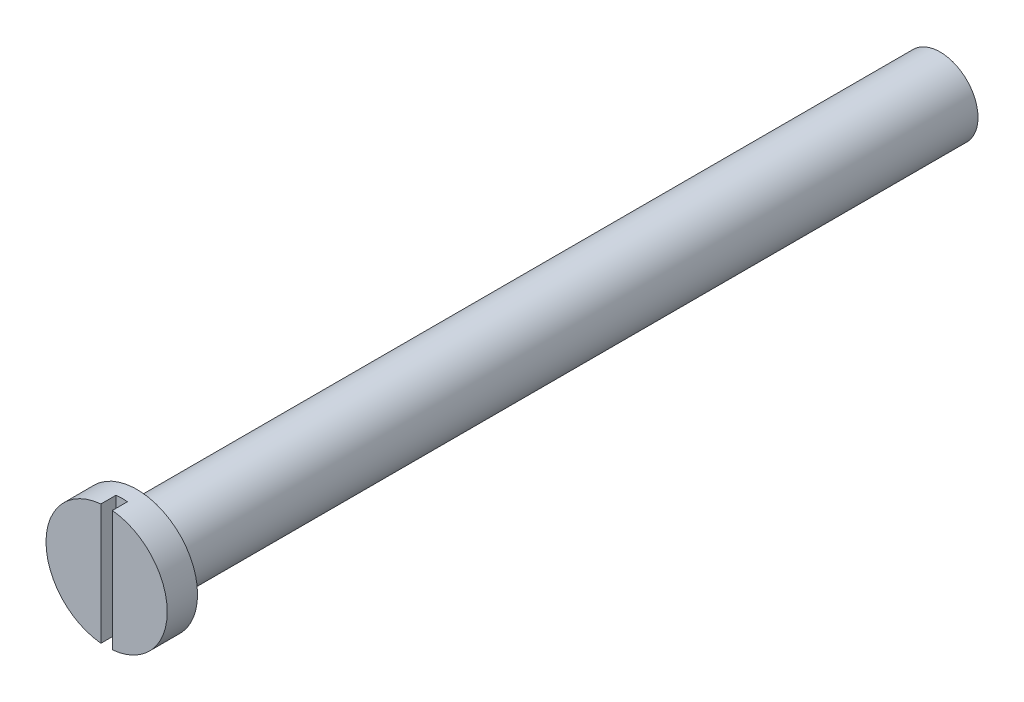
ISO-10303-21;
HEADER;
FILE_DESCRIPTION(('STEP AP214'),'2;1');
FILE_NAME('part.step','',(''),(''),'','','');
FILE_SCHEMA(('AUTOMOTIVE_DESIGN { 1 0 10303 214 1 1 1 1 }'));
ENDSEC;
DATA;
#1=APPLICATION_CONTEXT('core data for automotive mechanical design processes');
#2=APPLICATION_PROTOCOL_DEFINITION('international standard','automotive_design',2000,#1);
#3=PRODUCT_CONTEXT('',#1,'mechanical');
#4=PRODUCT('Part','Part','',(#3));
#5=PRODUCT_RELATED_PRODUCT_CATEGORY('part','',(#4));
#6=PRODUCT_DEFINITION_FORMATION('','',#4);
#7=PRODUCT_DEFINITION_CONTEXT('part definition',#1,'design');
#8=PRODUCT_DEFINITION('design','',#6,#7);
#9=PRODUCT_DEFINITION_SHAPE('','',#8);
#10=(LENGTH_UNIT() NAMED_UNIT(*) SI_UNIT(.MILLI.,.METRE.));
#11=(NAMED_UNIT(*) PLANE_ANGLE_UNIT() SI_UNIT($,.RADIAN.));
#12=(NAMED_UNIT(*) SI_UNIT($,.STERADIAN.) SOLID_ANGLE_UNIT());
#13=UNCERTAINTY_MEASURE_WITH_UNIT(LENGTH_MEASURE(1.E-05),#10,'distance_accuracy_value','');
#14=(GEOMETRIC_REPRESENTATION_CONTEXT(3) GLOBAL_UNCERTAINTY_ASSIGNED_CONTEXT((#13)) GLOBAL_UNIT_ASSIGNED_CONTEXT((#10,
#11,#12)) REPRESENTATION_CONTEXT('',''));
#15=CARTESIAN_POINT('',(0.,0.,0.));
#16=DIRECTION('',(0.,0.,1.));
#17=DIRECTION('',(1.,0.,0.));
#18=AXIS2_PLACEMENT_3D('',#15,#16,#17);
#19=CARTESIAN_POINT('',(0.,0.,110.));
#20=DIRECTION('',(0.,0.,1.));
#21=DIRECTION('',(1.,0.,0.));
#22=AXIS2_PLACEMENT_3D('',#19,#20,#21);
#23=PLANE('',#22);
#24=DIRECTION('',(0.,1.,0.));
#25=VECTOR('',#24,1.);
#26=CARTESIAN_POINT('',(0.75,0.,110.));
#27=LINE('',#26,#25);
#28=CARTESIAN_POINT('',(0.75,-7.96476616103699,110.));
#29=VERTEX_POINT('',#28);
#30=CARTESIAN_POINT('',(0.75,7.964766161037,110.));
#31=VERTEX_POINT('',#30);
#32=EDGE_CURVE('E122',#29,#31,#27,.T.);
#33=ORIENTED_EDGE('',*,*,#32,.F.);
#34=CARTESIAN_POINT('',(0.,0.,110.));
#35=DIRECTION('',(0.,0.,1.));
#36=DIRECTION('',(1.,0.,0.));
#37=AXIS2_PLACEMENT_3D('',#34,#35,#36);
#38=CIRCLE('',#37,8.);
#39=EDGE_CURVE('E109',#29,#31,#38,.T.);
#40=ORIENTED_EDGE('',*,*,#39,.T.);
#41=EDGE_LOOP('',(#33,#40));
#42=FACE_BOUND('',#41,.T.);
#43=ADVANCED_FACE('F37',(#42),#23,.T.);
#44=CARTESIAN_POINT('',(0.,0.,106.));
#45=DIRECTION('',(0.,0.,-1.));
#46=DIRECTION('',(-1.,0.,0.));
#47=AXIS2_PLACEMENT_3D('',#44,#45,#46);
#48=CYLINDRICAL_SURFACE('',#47,5.);
#49=CARTESIAN_POINT('',(0.,0.,106.));
#50=DIRECTION('',(0.,0.,1.));
#51=DIRECTION('',(1.,0.,0.));
#52=AXIS2_PLACEMENT_3D('',#49,#50,#51);
#53=CIRCLE('',#52,5.);
#54=CARTESIAN_POINT('',(5.,0.,106.));
#55=VERTEX_POINT('',#54);
#56=EDGE_CURVE('E115',#55,#55,#53,.T.);
#57=ORIENTED_EDGE('',*,*,#56,.F.);
#58=EDGE_LOOP('',(#57));
#59=FACE_BOUND('',#58,.T.);
#60=CARTESIAN_POINT('',(0.,0.,0.));
#61=DIRECTION('',(0.,0.,1.));
#62=DIRECTION('',(1.,0.,0.));
#63=AXIS2_PLACEMENT_3D('',#60,#61,#62);
#64=CIRCLE('',#63,5.);
#65=CARTESIAN_POINT('',(5.,0.,0.));
#66=VERTEX_POINT('',#65);
#67=EDGE_CURVE('E119',#66,#66,#64,.T.);
#68=ORIENTED_EDGE('',*,*,#67,.T.);
#69=EDGE_LOOP('',(#68));
#70=FACE_BOUND('',#69,.T.);
#71=ADVANCED_FACE('F39',(#59,#70),#48,.T.);
#72=CARTESIAN_POINT('',(0.,0.,0.));
#73=DIRECTION('',(0.,0.,1.));
#74=DIRECTION('',(1.,0.,0.));
#75=AXIS2_PLACEMENT_3D('',#72,#73,#74);
#76=PLANE('',#75);
#77=CARTESIAN_POINT('',(0.,0.,0.));
#78=DIRECTION('',(0.,0.,-1.));
#79=DIRECTION('',(-1.,0.,0.));
#80=AXIS2_PLACEMENT_3D('',#77,#78,#79);
#81=CIRCLE('',#80,3.4);
#82=CARTESIAN_POINT('',(-3.4,0.,0.));
#83=VERTEX_POINT('',#82);
#84=EDGE_CURVE('E91',#83,#83,#81,.T.);
#85=ORIENTED_EDGE('',*,*,#84,.F.);
#86=EDGE_LOOP('',(#85));
#87=FACE_BOUND('',#86,.T.);
#88=ORIENTED_EDGE('',*,*,#67,.F.);
#89=EDGE_LOOP('',(#88));
#90=FACE_BOUND('',#89,.T.);
#91=ADVANCED_FACE('F140',(#87,#90),#76,.F.);
#92=CARTESIAN_POINT('',(0.,0.,110.));
#93=DIRECTION('',(0.,0.,-1.));
#94=DIRECTION('',(-1.,0.,0.));
#95=AXIS2_PLACEMENT_3D('',#92,#93,#94);
#96=CYLINDRICAL_SURFACE('',#95,8.);
#97=CARTESIAN_POINT('',(0.,0.,108.));
#98=DIRECTION('',(0.,0.,1.));
#99=DIRECTION('',(1.,0.,0.));
#100=AXIS2_PLACEMENT_3D('',#97,#98,#99);
#101=CIRCLE('',#100,8.);
#102=CARTESIAN_POINT('',(0.75,7.964766161037,108.));
#103=VERTEX_POINT('',#102);
#104=CARTESIAN_POINT('',(-0.75,7.96476616103699,108.));
#105=VERTEX_POINT('',#104);
#106=EDGE_CURVE('E11',#103,#105,#101,.T.);
#107=ORIENTED_EDGE('',*,*,#106,.F.);
#108=DIRECTION('',(0.,0.,-1.));
#109=VECTOR('',#108,1.);
#110=CARTESIAN_POINT('',(0.75,7.964766161037,110.));
#111=LINE('',#110,#109);
#112=EDGE_CURVE('E60',#103,#31,#111,.F.);
#113=ORIENTED_EDGE('',*,*,#112,.T.);
#114=ORIENTED_EDGE('',*,*,#39,.F.);
#115=DIRECTION('',(0.,0.,-1.));
#116=VECTOR('',#115,1.);
#117=CARTESIAN_POINT('',(0.75,-7.964766161037,110.));
#118=LINE('',#117,#116);
#119=CARTESIAN_POINT('',(0.75,-7.964766161037,108.));
#120=VERTEX_POINT('',#119);
#121=EDGE_CURVE('E105',#29,#120,#118,.T.);
#122=ORIENTED_EDGE('',*,*,#121,.T.);
#123=CARTESIAN_POINT('',(-0.75,-7.96476616103699,108.));
#124=VERTEX_POINT('',#123);
#125=EDGE_CURVE('E41',#124,#120,#101,.T.);
#126=ORIENTED_EDGE('',*,*,#125,.F.);
#127=DIRECTION('',(0.,0.,-1.));
#128=VECTOR('',#127,1.);
#129=CARTESIAN_POINT('',(-0.75,-7.96476616103699,110.));
#130=LINE('',#129,#128);
#131=CARTESIAN_POINT('',(-0.75,-7.96476616103699,110.));
#132=VERTEX_POINT('',#131);
#133=EDGE_CURVE('E100',#124,#132,#130,.F.);
#134=ORIENTED_EDGE('',*,*,#133,.T.);
#135=CARTESIAN_POINT('',(-0.75,7.96476616103699,110.));
#136=VERTEX_POINT('',#135);
#137=EDGE_CURVE('E112',#136,#132,#38,.T.);
#138=ORIENTED_EDGE('',*,*,#137,.F.);
#139=DIRECTION('',(0.,0.,-1.));
#140=VECTOR('',#139,1.);
#141=CARTESIAN_POINT('',(-0.75,7.96476616103699,110.));
#142=LINE('',#141,#140);
#143=EDGE_CURVE('E52',#136,#105,#142,.T.);
#144=ORIENTED_EDGE('',*,*,#143,.T.);
#145=EDGE_LOOP('',(#107,#113,#114,#122,#126,#134,#138,#144));
#146=FACE_BOUND('',#145,.T.);
#147=CARTESIAN_POINT('',(0.,0.,106.));
#148=DIRECTION('',(0.,0.,1.));
#149=DIRECTION('',(1.,0.,0.));
#150=AXIS2_PLACEMENT_3D('',#147,#148,#149);
#151=CIRCLE('',#150,8.);
#152=CARTESIAN_POINT('',(8.,0.,106.));
#153=VERTEX_POINT('',#152);
#154=EDGE_CURVE('E108',#153,#153,#151,.T.);
#155=ORIENTED_EDGE('',*,*,#154,.T.);
#156=EDGE_LOOP('',(#155));
#157=FACE_BOUND('',#156,.T.);
#158=ADVANCED_FACE('F131',(#146,#157),#96,.T.);
#159=DIRECTION('',(0.,-1.,0.));
#160=VECTOR('',#159,1.);
#161=CARTESIAN_POINT('',(-0.75,0.,110.));
#162=LINE('',#161,#160);
#163=EDGE_CURVE('E118',#136,#132,#162,.T.);
#164=ORIENTED_EDGE('',*,*,#163,.F.);
#165=ORIENTED_EDGE('',*,*,#137,.T.);
#166=EDGE_LOOP('',(#164,#165));
#167=FACE_BOUND('',#166,.T.);
#168=ADVANCED_FACE('F136',(#167),#23,.T.);
#169=CARTESIAN_POINT('',(0.,0.,106.));
#170=DIRECTION('',(0.,0.,1.));
#171=DIRECTION('',(1.,0.,0.));
#172=AXIS2_PLACEMENT_3D('',#169,#170,#171);
#173=PLANE('',#172);
#174=ORIENTED_EDGE('',*,*,#56,.T.);
#175=EDGE_LOOP('',(#174));
#176=FACE_BOUND('',#175,.T.);
#177=ORIENTED_EDGE('',*,*,#154,.F.);
#178=EDGE_LOOP('',(#177));
#179=FACE_BOUND('',#178,.T.);
#180=ADVANCED_FACE('F145',(#176,#179),#173,.F.);
#181=CARTESIAN_POINT('',(0.,0.,108.));
#182=DIRECTION('',(0.,0.,1.));
#183=DIRECTION('',(1.,0.,0.));
#184=AXIS2_PLACEMENT_3D('',#181,#182,#183);
#185=PLANE('',#184);
#186=ORIENTED_EDGE('',*,*,#106,.T.);
#187=DIRECTION('',(0.,-1.,0.));
#188=VECTOR('',#187,1.);
#189=CARTESIAN_POINT('',(-0.75,9.78002511975092,108.));
#190=LINE('',#189,#188);
#191=EDGE_CURVE('E93',#105,#124,#190,.T.);
#192=ORIENTED_EDGE('',*,*,#191,.T.);
#193=ORIENTED_EDGE('',*,*,#125,.T.);
#194=DIRECTION('',(0.,1.,0.));
#195=VECTOR('',#194,1.);
#196=CARTESIAN_POINT('',(0.75,9.78002511975092,108.));
#197=LINE('',#196,#195);
#198=EDGE_CURVE('E90',#120,#103,#197,.T.);
#199=ORIENTED_EDGE('',*,*,#198,.T.);
#200=EDGE_LOOP('',(#186,#192,#193,#199));
#201=FACE_BOUND('',#200,.T.);
#202=ADVANCED_FACE('F126',(#201),#185,.T.);
#203=CARTESIAN_POINT('',(0.75,9.78002511975092,108.));
#204=DIRECTION('',(1.,0.,0.));
#205=DIRECTION('',(0.,0.,-1.));
#206=AXIS2_PLACEMENT_3D('',#203,#204,#205);
#207=PLANE('',#206);
#208=ORIENTED_EDGE('',*,*,#32,.T.);
#209=ORIENTED_EDGE('',*,*,#112,.F.);
#210=ORIENTED_EDGE('',*,*,#198,.F.);
#211=ORIENTED_EDGE('',*,*,#121,.F.);
#212=EDGE_LOOP('',(#208,#209,#210,#211));
#213=FACE_BOUND('',#212,.T.);
#214=ADVANCED_FACE('F129',(#213),#207,.F.);
#215=CARTESIAN_POINT('',(-0.75,9.78002511975092,108.));
#216=DIRECTION('',(-1.,0.,0.));
#217=DIRECTION('',(0.,0.,1.));
#218=AXIS2_PLACEMENT_3D('',#215,#216,#217);
#219=PLANE('',#218);
#220=ORIENTED_EDGE('',*,*,#163,.T.);
#221=ORIENTED_EDGE('',*,*,#133,.F.);
#222=ORIENTED_EDGE('',*,*,#191,.F.);
#223=ORIENTED_EDGE('',*,*,#143,.F.);
#224=EDGE_LOOP('',(#220,#221,#222,#223));
#225=FACE_BOUND('',#224,.T.);
#226=ADVANCED_FACE('F84',(#225),#219,.F.);
#227=CARTESIAN_POINT('',(0.,0.,15.));
#228=DIRECTION('',(0.,0.,-1.));
#229=DIRECTION('',(-1.,0.,0.));
#230=AXIS2_PLACEMENT_3D('',#227,#228,#229);
#231=CONICAL_SURFACE('',#230,3.39999999999998,1.02974425867665);
#232=CARTESIAN_POINT('',(0.,0.,17.0429261046937));
#233=VERTEX_POINT('',#232);
#234=VERTEX_LOOP('',#233);
#235=FACE_BOUND('',#234,.T.);
#236=CARTESIAN_POINT('',(0.,0.,15.));
#237=DIRECTION('',(0.,0.,-1.));
#238=DIRECTION('',(-1.,0.,0.));
#239=AXIS2_PLACEMENT_3D('',#236,#237,#238);
#240=CIRCLE('',#239,3.39999999999998);
#241=CARTESIAN_POINT('',(-3.39999999999998,0.,15.));
#242=VERTEX_POINT('',#241);
#243=EDGE_CURVE('E88',#242,#242,#240,.T.);
#244=ORIENTED_EDGE('',*,*,#243,.T.);
#245=EDGE_LOOP('',(#244));
#246=FACE_BOUND('',#245,.T.);
#247=ADVANCED_FACE('F80',(#235,#246),#231,.F.);
#248=CARTESIAN_POINT('',(0.,0.,0.));
#249=DIRECTION('',(0.,0.,-1.));
#250=DIRECTION('',(-1.,0.,0.));
#251=AXIS2_PLACEMENT_3D('',#248,#249,#250);
#252=CYLINDRICAL_SURFACE('',#251,3.39999999999999);
#253=ORIENTED_EDGE('',*,*,#243,.F.);
#254=EDGE_LOOP('',(#253));
#255=FACE_BOUND('',#254,.T.);
#256=ORIENTED_EDGE('',*,*,#84,.T.);
#257=EDGE_LOOP('',(#256));
#258=FACE_BOUND('',#257,.T.);
#259=ADVANCED_FACE('F83',(#255,#258),#252,.F.);
#260=CLOSED_SHELL('',(#43,#71,#91,#158,#168,#180,#202,#214,#226,#247,#259));
#261=MANIFOLD_SOLID_BREP('B2',#260);
#262=ADVANCED_BREP_SHAPE_REPRESENTATION('',(#18,#261),#14);
#263=SHAPE_DEFINITION_REPRESENTATION(#9,#262);
ENDSEC;
END-ISO-10303-21;
